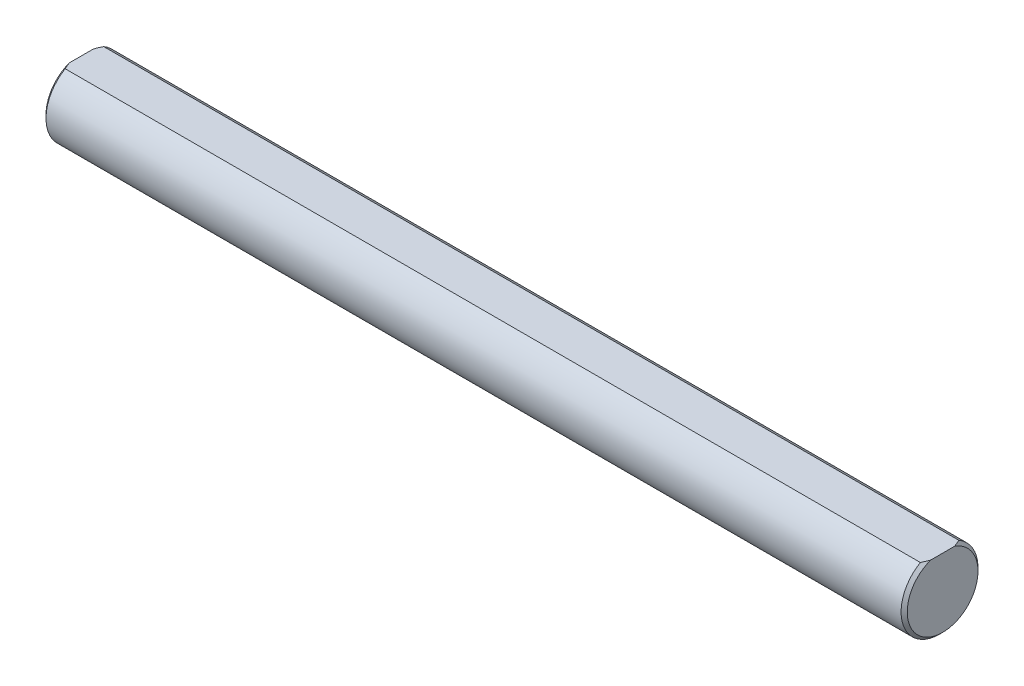
ISO-10303-21;
HEADER;
FILE_DESCRIPTION(('STEP AP214'),'2;1');
FILE_NAME('part.step','',(''),(''),'','','');
FILE_SCHEMA(('AUTOMOTIVE_DESIGN { 1 0 10303 214 1 1 1 1 }'));
ENDSEC;
DATA;
#1=APPLICATION_CONTEXT('core data for automotive mechanical design processes');
#2=APPLICATION_PROTOCOL_DEFINITION('international standard','automotive_design',2000,#1);
#3=PRODUCT_CONTEXT('',#1,'mechanical');
#4=PRODUCT('Part','Part','',(#3));
#5=PRODUCT_RELATED_PRODUCT_CATEGORY('part','',(#4));
#6=PRODUCT_DEFINITION_FORMATION('','',#4);
#7=PRODUCT_DEFINITION_CONTEXT('part definition',#1,'design');
#8=PRODUCT_DEFINITION('design','',#6,#7);
#9=PRODUCT_DEFINITION_SHAPE('','',#8);
#10=(LENGTH_UNIT() NAMED_UNIT(*) SI_UNIT(.MILLI.,.METRE.));
#11=(NAMED_UNIT(*) PLANE_ANGLE_UNIT() SI_UNIT($,.RADIAN.));
#12=(NAMED_UNIT(*) SI_UNIT($,.STERADIAN.) SOLID_ANGLE_UNIT());
#13=UNCERTAINTY_MEASURE_WITH_UNIT(LENGTH_MEASURE(1.E-05),#10,'distance_accuracy_value','');
#14=(GEOMETRIC_REPRESENTATION_CONTEXT(3) GLOBAL_UNCERTAINTY_ASSIGNED_CONTEXT((#13)) GLOBAL_UNIT_ASSIGNED_CONTEXT((#10,
#11,#12)) REPRESENTATION_CONTEXT('',''));
#15=CARTESIAN_POINT('',(0.,0.,0.));
#16=DIRECTION('',(0.,0.,1.));
#17=DIRECTION('',(1.,0.,0.));
#18=AXIS2_PLACEMENT_3D('',#15,#16,#17);
#19=CARTESIAN_POINT('',(71.12,0.,0.));
#20=DIRECTION('',(-1.,0.,0.));
#21=DIRECTION('',(0.,0.,1.));
#22=AXIS2_PLACEMENT_3D('',#19,#20,#21);
#23=CYLINDRICAL_SURFACE('',#22,3.175);
#24=CARTESIAN_POINT('',(70.866,0.,0.));
#25=DIRECTION('',(1.,0.,0.));
#26=DIRECTION('',(0.,0.,-1.));
#27=AXIS2_PLACEMENT_3D('',#24,#25,#26);
#28=CIRCLE('',#27,3.175);
#29=CARTESIAN_POINT('',(70.866,2.74963065701559,-1.5875));
#30=VERTEX_POINT('',#29);
#31=CARTESIAN_POINT('',(70.866,2.74963065701559,1.5875));
#32=VERTEX_POINT('',#31);
#33=EDGE_CURVE('E109',#30,#32,#28,.F.);
#34=ORIENTED_EDGE('',*,*,#33,.T.);
#35=DIRECTION('',(1.,0.,0.));
#36=VECTOR('',#35,1.);
#37=CARTESIAN_POINT('',(0.,2.74963065701559,1.5875));
#38=LINE('',#37,#36);
#39=CARTESIAN_POINT('',(0.25399999999999,2.74963065701559,1.5875));
#40=VERTEX_POINT('',#39);
#41=EDGE_CURVE('E105',#40,#32,#38,.T.);
#42=ORIENTED_EDGE('',*,*,#41,.F.);
#43=CARTESIAN_POINT('',(0.25399999999999,0.,0.));
#44=DIRECTION('',(1.,0.,0.));
#45=DIRECTION('',(0.,0.,-1.));
#46=AXIS2_PLACEMENT_3D('',#43,#44,#45);
#47=CIRCLE('',#46,3.175);
#48=CARTESIAN_POINT('',(0.25399999999999,2.74963065701559,-1.5875));
#49=VERTEX_POINT('',#48);
#50=EDGE_CURVE('E113',#40,#49,#47,.T.);
#51=ORIENTED_EDGE('',*,*,#50,.T.);
#52=DIRECTION('',(1.,0.,0.));
#53=VECTOR('',#52,1.);
#54=CARTESIAN_POINT('',(0.,2.74963065701559,-1.5875));
#55=LINE('',#54,#53);
#56=EDGE_CURVE('E95',#49,#30,#55,.T.);
#57=ORIENTED_EDGE('',*,*,#56,.T.);
#58=EDGE_LOOP('',(#34,#42,#51,#57));
#59=FACE_BOUND('',#58,.T.);
#60=ADVANCED_FACE('F49',(#59),#23,.T.);
#61=CARTESIAN_POINT('',(71.12,0.,0.));
#62=DIRECTION('',(1.,0.,0.));
#63=DIRECTION('',(0.,0.,-1.));
#64=AXIS2_PLACEMENT_3D('',#61,#62,#63);
#65=PLANE('',#64);
#66=DIRECTION('',(0.,0.,-1.));
#67=VECTOR('',#66,1.);
#68=CARTESIAN_POINT('',(71.12,2.74963065701559,1.5875));
#69=LINE('',#68,#67);
#70=CARTESIAN_POINT('',(71.12,2.74963065701559,0.985785093212471));
#71=VERTEX_POINT('',#70);
#72=CARTESIAN_POINT('',(71.12,2.74963065701559,-0.985785093212471));
#73=VERTEX_POINT('',#72);
#74=EDGE_CURVE('E106',#71,#73,#69,.T.);
#75=ORIENTED_EDGE('',*,*,#74,.F.);
#76=CARTESIAN_POINT('',(71.12,0.,0.));
#77=DIRECTION('',(1.,0.,0.));
#78=DIRECTION('',(0.,0.,-1.));
#79=AXIS2_PLACEMENT_3D('',#76,#77,#78);
#80=CIRCLE('',#79,2.92099999999999);
#81=EDGE_CURVE('E118',#71,#73,#80,.T.);
#82=ORIENTED_EDGE('',*,*,#81,.T.);
#83=EDGE_LOOP('',(#75,#82));
#84=FACE_BOUND('',#83,.T.);
#85=ADVANCED_FACE('F137',(#84),#65,.T.);
#86=CARTESIAN_POINT('',(0.,0.,0.));
#87=DIRECTION('',(1.,0.,0.));
#88=DIRECTION('',(0.,0.,-1.));
#89=AXIS2_PLACEMENT_3D('',#86,#87,#88);
#90=PLANE('',#89);
#91=CARTESIAN_POINT('',(0.,0.,0.));
#92=DIRECTION('',(1.,0.,0.));
#93=DIRECTION('',(0.,0.,-1.));
#94=AXIS2_PLACEMENT_3D('',#91,#92,#93);
#95=CIRCLE('',#94,2.921);
#96=CARTESIAN_POINT('',(0.,2.74963065701559,-0.985785093212512));
#97=VERTEX_POINT('',#96);
#98=CARTESIAN_POINT('',(0.,2.74963065701559,0.985785093212512));
#99=VERTEX_POINT('',#98);
#100=EDGE_CURVE('E103',#97,#99,#95,.F.);
#101=ORIENTED_EDGE('',*,*,#100,.T.);
#102=DIRECTION('',(0.,0.,-1.));
#103=VECTOR('',#102,1.);
#104=CARTESIAN_POINT('',(0.,2.74963065701559,1.5875));
#105=LINE('',#104,#103);
#106=EDGE_CURVE('E71',#99,#97,#105,.T.);
#107=ORIENTED_EDGE('',*,*,#106,.T.);
#108=EDGE_LOOP('',(#101,#107));
#109=FACE_BOUND('',#108,.T.);
#110=ADVANCED_FACE('F102',(#109),#90,.F.);
#111=CARTESIAN_POINT('',(71.12,0.,0.));
#112=DIRECTION('',(-1.,0.,0.));
#113=DIRECTION('',(0.,0.,1.));
#114=AXIS2_PLACEMENT_3D('',#111,#112,#113);
#115=CONICAL_SURFACE('',#114,2.92099999999999,0.785398163397412);
#116=CARTESIAN_POINT('',(70.8656499421323,2.74963065701559,1.5882));
#117=CARTESIAN_POINT('',(70.9201996989638,2.74963065701559,1.47903148983546));
#118=CARTESIAN_POINT('',(70.9715467736487,2.74963065701559,1.36803725312434));
#119=CARTESIAN_POINT('',(71.0655640164844,2.74963065701559,1.14170613856966));
#120=CARTESIAN_POINT('',(71.1081818395587,2.74963065701559,1.02634771127011));
#121=CARTESIAN_POINT('',(71.181188105863,2.74963065701559,0.793732645811777));
#122=CARTESIAN_POINT('',(71.2117601474436,2.74963065701559,0.676535314799183));
#123=CARTESIAN_POINT('',(71.2588637626289,2.74963065701559,0.439559207905073));
#124=CARTESIAN_POINT('',(71.2754305251547,2.74963065701559,0.319787681762738));
#125=CARTESIAN_POINT('',(71.2903772767312,2.74963065701559,0.113390763403458));
#126=CARTESIAN_POINT('',(71.2925911723138,2.74963065701559,0.0270323810888386));
#127=CARTESIAN_POINT('',(71.2888706827955,2.74963065701559,-0.14554346955512));
#128=CARTESIAN_POINT('',(71.2829334400268,2.74963065701559,-0.231760877849774));
#129=CARTESIAN_POINT('',(71.263248527632,2.74963065701559,-0.403381872739507));
#130=CARTESIAN_POINT('',(71.2494921121184,2.74963065701559,-0.488784438972549));
#131=CARTESIAN_POINT('',(71.2149240312319,2.74963065701559,-0.658112847485011));
#132=CARTESIAN_POINT('',(71.1941129063332,2.74963065701559,-0.742038802372366));
#133=CARTESIAN_POINT('',(71.1323041723801,2.74963065701559,-0.957097052575721));
#134=CARTESIAN_POINT('',(71.0866386107287,2.74963065701559,-1.0868935385232));
#135=CARTESIAN_POINT('',(71.009545010794,2.74963065701559,-1.27774543186097));
#136=CARTESIAN_POINT('',(70.982457262408,2.74963065701559,-1.34063930357718));
#137=CARTESIAN_POINT('',(70.9258118782309,2.74963065701559,-1.46526121960737));
#138=CARTESIAN_POINT('',(70.8962557633007,2.74963065701559,-1.52698995347894));
#139=CARTESIAN_POINT('',(70.8656499421323,2.74963065701559,-1.5882));
#140=B_SPLINE_CURVE_WITH_KNOTS('',3,(#116,#117,#118,#119,#120,#121,#122,#123,#124,#125,#126,
#127,#128,#129,#130,#131,#132,#133,#134,#135,#136,#137,#138,#139),.UNSPECIFIED.,.F.,.F.,(4,2,2,
2,2,2,2,2,2,2,2,4),(0.,0.3663698111388,0.734876090737454,1.09752564771275,1.45926129943158,
1.7180547703143,1.97693899350515,2.23611335485391,2.49526786486608,2.90718803562737,
3.11259006926561,3.31786646708286),.UNSPECIFIED.);
#141=EDGE_CURVE('E122',#32,#71,#140,.T.);
#142=ORIENTED_EDGE('',*,*,#141,.F.);
#143=ORIENTED_EDGE('',*,*,#33,.F.);
#144=EDGE_CURVE('E78',#73,#30,#140,.T.);
#145=ORIENTED_EDGE('',*,*,#144,.F.);
#146=ORIENTED_EDGE('',*,*,#81,.F.);
#147=EDGE_LOOP('',(#142,#143,#145,#146));
#148=FACE_BOUND('',#147,.T.);
#149=ADVANCED_FACE('F131',(#148),#115,.T.);
#150=CARTESIAN_POINT('',(0.25399999999999,0.,0.));
#151=DIRECTION('',(1.,0.,0.));
#152=DIRECTION('',(0.,0.,-1.));
#153=AXIS2_PLACEMENT_3D('',#150,#151,#152);
#154=CONICAL_SURFACE('',#153,3.175,0.785398163397466);
#155=CARTESIAN_POINT('',(0.254350057867626,2.74963065701559,-1.5882));
#156=CARTESIAN_POINT('',(0.199800301036159,2.74963065701559,-1.47903148983545));
#157=CARTESIAN_POINT('',(0.148453226351224,2.74963065701559,-1.36803725312432));
#158=CARTESIAN_POINT('',(0.0544359835155364,2.74963065701559,-1.14170613856962));
#159=CARTESIAN_POINT('',(0.0118181604412198,2.74963065701559,-1.02634771127007));
#160=CARTESIAN_POINT('',(-0.0611881058630326,2.74963065701559,-0.793732645811711));
#161=CARTESIAN_POINT('',(-0.0917601474436511,2.74963065701559,-0.676535314799108));
#162=CARTESIAN_POINT('',(-0.138863762628959,2.74963065701559,-0.439559207904981));
#163=CARTESIAN_POINT('',(-0.155430525154694,2.74963065701559,-0.319787681762638));
#164=CARTESIAN_POINT('',(-0.170377276731214,2.74963065701559,-0.113390763403339));
#165=CARTESIAN_POINT('',(-0.172591172313841,2.74963065701559,-0.0270323810887076));
#166=CARTESIAN_POINT('',(-0.168870682795481,2.74963065701559,0.145543469555275));
#167=CARTESIAN_POINT('',(-0.162933440026822,2.74963065701559,0.23176087784994));
#168=CARTESIAN_POINT('',(-0.143248527631973,2.74963065701559,0.403381872739695));
#169=CARTESIAN_POINT('',(-0.129492112118343,2.74963065701559,0.488784438972748));
#170=CARTESIAN_POINT('',(-0.0949240312318517,2.74963065701559,0.658112847485232));
#171=CARTESIAN_POINT('',(-0.0741129063331933,2.74963065701559,0.742038802372597));
#172=CARTESIAN_POINT('',(-0.0123041723800202,2.74963065701559,0.957097052575919));
#173=CARTESIAN_POINT('',(0.0333613892713736,2.74963065701559,1.08689353852335));
#174=CARTESIAN_POINT('',(0.110454989206024,2.74963065701559,1.27774543186107));
#175=CARTESIAN_POINT('',(0.137542737592013,2.74963065701559,1.34063930357726));
#176=CARTESIAN_POINT('',(0.19418812176909,2.74963065701559,1.46526121960741));
#177=CARTESIAN_POINT('',(0.223744236699278,2.74963065701559,1.52698995347896));
#178=CARTESIAN_POINT('',(0.254350057867626,2.74963065701559,1.5882));
#179=B_SPLINE_CURVE_WITH_KNOTS('',3,(#155,#156,#157,#158,#159,#160,#161,#162,#163,#164,#165,
#166,#167,#168,#169,#170,#171,#172,#173,#174,#175,#176,#177,#178),.UNSPECIFIED.,.F.,.F.,(4,2,2,
2,2,2,2,2,2,2,2,4),(0.,0.366369811138819,0.734876090737502,1.09752564771282,1.45926129943167,
1.71805477031443,1.97693899350531,2.23611335485411,2.49526786486632,2.90718803562747,
3.11259006926565,3.31786646708283),.UNSPECIFIED.);
#180=EDGE_CURVE('E11',#49,#97,#179,.T.);
#181=ORIENTED_EDGE('',*,*,#180,.F.);
#182=ORIENTED_EDGE('',*,*,#50,.F.);
#183=EDGE_CURVE('E55',#99,#40,#179,.T.);
#184=ORIENTED_EDGE('',*,*,#183,.F.);
#185=ORIENTED_EDGE('',*,*,#100,.F.);
#186=EDGE_LOOP('',(#181,#182,#184,#185));
#187=FACE_BOUND('',#186,.T.);
#188=ADVANCED_FACE('F52',(#187),#154,.T.);
#189=CARTESIAN_POINT('',(0.,2.74963065701559,1.5875));
#190=DIRECTION('',(0.,-1.,0.));
#191=DIRECTION('',(0.,0.,-1.));
#192=AXIS2_PLACEMENT_3D('',#189,#190,#191);
#193=PLANE('',#192);
#194=ORIENTED_EDGE('',*,*,#141,.T.);
#195=ORIENTED_EDGE('',*,*,#74,.T.);
#196=ORIENTED_EDGE('',*,*,#144,.T.);
#197=ORIENTED_EDGE('',*,*,#56,.F.);
#198=ORIENTED_EDGE('',*,*,#180,.T.);
#199=ORIENTED_EDGE('',*,*,#106,.F.);
#200=ORIENTED_EDGE('',*,*,#183,.T.);
#201=ORIENTED_EDGE('',*,*,#41,.T.);
#202=EDGE_LOOP('',(#194,#195,#196,#197,#198,#199,#200,#201));
#203=FACE_BOUND('',#202,.T.);
#204=ADVANCED_FACE('F94',(#203),#193,.F.);
#205=CLOSED_SHELL('',(#60,#85,#110,#149,#188,#204));
#206=MANIFOLD_SOLID_BREP('B2',#205);
#207=ADVANCED_BREP_SHAPE_REPRESENTATION('',(#18,#206),#14);
#208=SHAPE_DEFINITION_REPRESENTATION(#9,#207);
ENDSEC;
END-ISO-10303-21;
